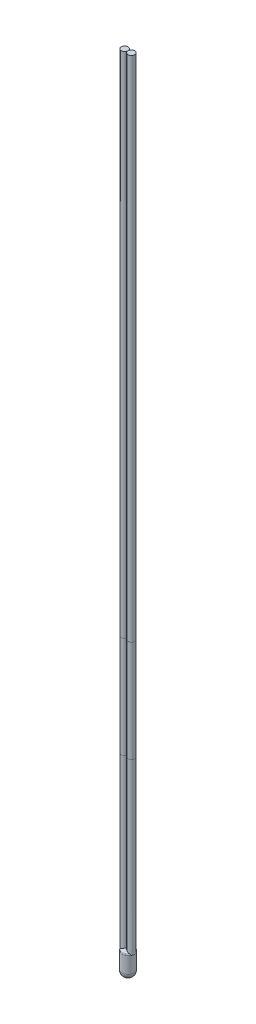
ISO-10303-21;
HEADER;
FILE_DESCRIPTION(('STEP AP214'),'2;1');
FILE_NAME('part.step','',(''),(''),'','','');
FILE_SCHEMA(('AUTOMOTIVE_DESIGN { 1 0 10303 214 1 1 1 1 }'));
ENDSEC;
DATA;
#1=APPLICATION_CONTEXT('core data for automotive mechanical design processes');
#2=APPLICATION_PROTOCOL_DEFINITION('international standard','automotive_design',2000,#1);
#3=PRODUCT_CONTEXT('',#1,'mechanical');
#4=PRODUCT('Part','Part','',(#3));
#5=PRODUCT_RELATED_PRODUCT_CATEGORY('part','',(#4));
#6=PRODUCT_DEFINITION_FORMATION('','',#4);
#7=PRODUCT_DEFINITION_CONTEXT('part definition',#1,'design');
#8=PRODUCT_DEFINITION('design','',#6,#7);
#9=PRODUCT_DEFINITION_SHAPE('','',#8);
#10=(LENGTH_UNIT() NAMED_UNIT(*) SI_UNIT(.MILLI.,.METRE.));
#11=(NAMED_UNIT(*) PLANE_ANGLE_UNIT() SI_UNIT($,.RADIAN.));
#12=(NAMED_UNIT(*) SI_UNIT($,.STERADIAN.) SOLID_ANGLE_UNIT());
#13=UNCERTAINTY_MEASURE_WITH_UNIT(LENGTH_MEASURE(1.E-05),#10,'distance_accuracy_value','');
#14=(GEOMETRIC_REPRESENTATION_CONTEXT(3) GLOBAL_UNCERTAINTY_ASSIGNED_CONTEXT((#13)) GLOBAL_UNIT_ASSIGNED_CONTEXT((#10,
#11,#12)) REPRESENTATION_CONTEXT('',''));
#15=CARTESIAN_POINT('',(0.,0.,0.));
#16=DIRECTION('',(0.,0.,1.));
#17=DIRECTION('',(1.,0.,0.));
#18=AXIS2_PLACEMENT_3D('',#15,#16,#17);
#19=CARTESIAN_POINT('',(0.4,117.41515621348,0.));
#20=DIRECTION('',(0.,-1.,0.));
#21=DIRECTION('',(0.,0.,-1.));
#22=AXIS2_PLACEMENT_3D('',#19,#20,#21);
#23=CYLINDRICAL_SURFACE('',#22,0.5);
#24=CARTESIAN_POINT('',(0.4,117.41515621348,0.));
#25=DIRECTION('',(0.,-1.,0.));
#26=DIRECTION('',(0.,0.,-1.));
#27=AXIS2_PLACEMENT_3D('',#24,#25,#26);
#28=CIRCLE('',#27,0.5);
#29=CARTESIAN_POINT('',(0.4,117.41515621348,-0.5));
#30=VERTEX_POINT('',#29);
#31=EDGE_CURVE('E11',#30,#30,#28,.T.);
#32=ORIENTED_EDGE('',*,*,#31,.T.);
#33=EDGE_LOOP('',(#32));
#34=FACE_BOUND('',#33,.T.);
#35=CARTESIAN_POINT('',(0.4,42.4151562134801,0.));
#36=DIRECTION('',(0.,-1.,0.));
#37=DIRECTION('',(0.,0.,-1.));
#38=AXIS2_PLACEMENT_3D('',#35,#36,#37);
#39=CIRCLE('',#38,0.5);
#40=CARTESIAN_POINT('',(0.4,42.4151562134801,-0.5));
#41=VERTEX_POINT('',#40);
#42=EDGE_CURVE('E46',#41,#41,#39,.T.);
#43=ORIENTED_EDGE('',*,*,#42,.F.);
#44=EDGE_LOOP('',(#43));
#45=FACE_BOUND('',#44,.T.);
#46=ADVANCED_FACE('F43',(#34,#45),#23,.T.);
#47=CARTESIAN_POINT('',(0.4,117.41515621348,0.));
#48=DIRECTION('',(0.,-1.,0.));
#49=DIRECTION('',(0.,0.,-1.));
#50=AXIS2_PLACEMENT_3D('',#47,#48,#49);
#51=PLANE('',#50);
#52=ORIENTED_EDGE('',*,*,#31,.F.);
#53=EDGE_LOOP('',(#52));
#54=FACE_BOUND('',#53,.T.);
#55=ADVANCED_FACE('F58',(#54),#51,.F.);
#56=CARTESIAN_POINT('',(0.4,42.4151562134801,0.));
#57=DIRECTION('',(0.,-1.,0.));
#58=DIRECTION('',(0.,0.,-1.));
#59=AXIS2_PLACEMENT_3D('',#56,#57,#58);
#60=PLANE('',#59);
#61=ORIENTED_EDGE('',*,*,#42,.T.);
#62=EDGE_LOOP('',(#61));
#63=FACE_BOUND('',#62,.T.);
#64=ADVANCED_FACE('F55',(#63),#60,.T.);
#65=CLOSED_SHELL('',(#46,#55,#64));
#66=MANIFOLD_SOLID_BREP('B2',#65);
#67=CARTESIAN_POINT('',(1.41,117.41515621348,0.));
#68=DIRECTION('',(0.,-1.,0.));
#69=DIRECTION('',(0.,0.,-1.));
#70=AXIS2_PLACEMENT_3D('',#67,#68,#69);
#71=CYLINDRICAL_SURFACE('',#70,0.5);
#72=CARTESIAN_POINT('',(1.41,117.41515621348,0.));
#73=DIRECTION('',(0.,-1.,0.));
#74=DIRECTION('',(0.,0.,-1.));
#75=AXIS2_PLACEMENT_3D('',#72,#73,#74);
#76=CIRCLE('',#75,0.5);
#77=CARTESIAN_POINT('',(1.41,117.41515621348,-0.5));
#78=VERTEX_POINT('',#77);
#79=EDGE_CURVE('E42',#78,#78,#76,.T.);
#80=ORIENTED_EDGE('',*,*,#79,.T.);
#81=EDGE_LOOP('',(#80));
#82=FACE_BOUND('',#81,.T.);
#83=CARTESIAN_POINT('',(1.41,42.4151562134801,0.));
#84=DIRECTION('',(0.,-1.,0.));
#85=DIRECTION('',(0.,0.,-1.));
#86=AXIS2_PLACEMENT_3D('',#83,#84,#85);
#87=CIRCLE('',#86,0.5);
#88=CARTESIAN_POINT('',(1.41,42.4151562134801,-0.5));
#89=VERTEX_POINT('',#88);
#90=EDGE_CURVE('E96',#89,#89,#87,.T.);
#91=ORIENTED_EDGE('',*,*,#90,.F.);
#92=EDGE_LOOP('',(#91));
#93=FACE_BOUND('',#92,.T.);
#94=ADVANCED_FACE('F93',(#82,#93),#71,.T.);
#95=CARTESIAN_POINT('',(1.41,117.41515621348,0.));
#96=DIRECTION('',(0.,-1.,0.));
#97=DIRECTION('',(0.,0.,-1.));
#98=AXIS2_PLACEMENT_3D('',#95,#96,#97);
#99=PLANE('',#98);
#100=ORIENTED_EDGE('',*,*,#79,.F.);
#101=EDGE_LOOP('',(#100));
#102=FACE_BOUND('',#101,.T.);
#103=ADVANCED_FACE('F108',(#102),#99,.F.);
#104=CARTESIAN_POINT('',(1.41,42.4151562134801,0.));
#105=DIRECTION('',(0.,-1.,0.));
#106=DIRECTION('',(0.,0.,-1.));
#107=AXIS2_PLACEMENT_3D('',#104,#105,#106);
#108=PLANE('',#107);
#109=ORIENTED_EDGE('',*,*,#90,.T.);
#110=EDGE_LOOP('',(#109));
#111=FACE_BOUND('',#110,.T.);
#112=ADVANCED_FACE('F105',(#111),#108,.T.);
#113=CLOSED_SHELL('',(#94,#103,#112));
#114=MANIFOLD_SOLID_BREP('B6',#113);
#115=CARTESIAN_POINT('',(0.4,42.41515621348,0.));
#116=DIRECTION('',(0.,-1.,0.));
#117=DIRECTION('',(0.,0.,-1.));
#118=AXIS2_PLACEMENT_3D('',#115,#116,#117);
#119=CYLINDRICAL_SURFACE('',#118,0.5);
#120=CARTESIAN_POINT('',(0.4,42.41515621348,0.));
#121=DIRECTION('',(0.,-1.,0.));
#122=DIRECTION('',(0.,0.,-1.));
#123=AXIS2_PLACEMENT_3D('',#120,#121,#122);
#124=CIRCLE('',#123,0.5);
#125=CARTESIAN_POINT('',(0.4,42.41515621348,-0.5));
#126=VERTEX_POINT('',#125);
#127=EDGE_CURVE('E92',#126,#126,#124,.T.);
#128=ORIENTED_EDGE('',*,*,#127,.T.);
#129=EDGE_LOOP('',(#128));
#130=FACE_BOUND('',#129,.T.);
#131=CARTESIAN_POINT('',(0.4,27.4151562134801,0.));
#132=DIRECTION('',(0.,-1.,0.));
#133=DIRECTION('',(0.,0.,-1.));
#134=AXIS2_PLACEMENT_3D('',#131,#132,#133);
#135=CIRCLE('',#134,0.5);
#136=CARTESIAN_POINT('',(0.4,27.4151562134801,-0.5));
#137=VERTEX_POINT('',#136);
#138=EDGE_CURVE('E146',#137,#137,#135,.T.);
#139=ORIENTED_EDGE('',*,*,#138,.F.);
#140=EDGE_LOOP('',(#139));
#141=FACE_BOUND('',#140,.T.);
#142=ADVANCED_FACE('F143',(#130,#141),#119,.T.);
#143=CARTESIAN_POINT('',(0.4,42.41515621348,0.));
#144=DIRECTION('',(0.,-1.,0.));
#145=DIRECTION('',(0.,0.,-1.));
#146=AXIS2_PLACEMENT_3D('',#143,#144,#145);
#147=PLANE('',#146);
#148=ORIENTED_EDGE('',*,*,#127,.F.);
#149=EDGE_LOOP('',(#148));
#150=FACE_BOUND('',#149,.T.);
#151=ADVANCED_FACE('F158',(#150),#147,.F.);
#152=CARTESIAN_POINT('',(0.4,27.4151562134801,0.));
#153=DIRECTION('',(0.,-1.,0.));
#154=DIRECTION('',(0.,0.,-1.));
#155=AXIS2_PLACEMENT_3D('',#152,#153,#154);
#156=PLANE('',#155);
#157=ORIENTED_EDGE('',*,*,#138,.T.);
#158=EDGE_LOOP('',(#157));
#159=FACE_BOUND('',#158,.T.);
#160=ADVANCED_FACE('F155',(#159),#156,.T.);
#161=CLOSED_SHELL('',(#142,#151,#160));
#162=MANIFOLD_SOLID_BREP('B37',#161);
#163=CARTESIAN_POINT('',(1.41,42.41515621348,0.));
#164=DIRECTION('',(0.,-1.,0.));
#165=DIRECTION('',(0.,0.,-1.));
#166=AXIS2_PLACEMENT_3D('',#163,#164,#165);
#167=CYLINDRICAL_SURFACE('',#166,0.5);
#168=CARTESIAN_POINT('',(1.41,42.41515621348,0.));
#169=DIRECTION('',(0.,-1.,0.));
#170=DIRECTION('',(0.,0.,-1.));
#171=AXIS2_PLACEMENT_3D('',#168,#169,#170);
#172=CIRCLE('',#171,0.5);
#173=CARTESIAN_POINT('',(1.41,42.41515621348,-0.5));
#174=VERTEX_POINT('',#173);
#175=EDGE_CURVE('E142',#174,#174,#172,.T.);
#176=ORIENTED_EDGE('',*,*,#175,.T.);
#177=EDGE_LOOP('',(#176));
#178=FACE_BOUND('',#177,.T.);
#179=CARTESIAN_POINT('',(1.41,27.4151562134801,0.));
#180=DIRECTION('',(0.,-1.,0.));
#181=DIRECTION('',(0.,0.,-1.));
#182=AXIS2_PLACEMENT_3D('',#179,#180,#181);
#183=CIRCLE('',#182,0.5);
#184=CARTESIAN_POINT('',(1.41,27.4151562134801,-0.5));
#185=VERTEX_POINT('',#184);
#186=EDGE_CURVE('E197',#185,#185,#183,.T.);
#187=ORIENTED_EDGE('',*,*,#186,.F.);
#188=EDGE_LOOP('',(#187));
#189=FACE_BOUND('',#188,.T.);
#190=ADVANCED_FACE('F194',(#178,#189),#167,.T.);
#191=CARTESIAN_POINT('',(1.41,42.41515621348,0.));
#192=DIRECTION('',(0.,-1.,0.));
#193=DIRECTION('',(0.,0.,-1.));
#194=AXIS2_PLACEMENT_3D('',#191,#192,#193);
#195=PLANE('',#194);
#196=ORIENTED_EDGE('',*,*,#175,.F.);
#197=EDGE_LOOP('',(#196));
#198=FACE_BOUND('',#197,.T.);
#199=ADVANCED_FACE('F209',(#198),#195,.F.);
#200=CARTESIAN_POINT('',(1.41,27.4151562134801,0.));
#201=DIRECTION('',(0.,-1.,0.));
#202=DIRECTION('',(0.,0.,-1.));
#203=AXIS2_PLACEMENT_3D('',#200,#201,#202);
#204=PLANE('',#203);
#205=ORIENTED_EDGE('',*,*,#186,.T.);
#206=EDGE_LOOP('',(#205));
#207=FACE_BOUND('',#206,.T.);
#208=ADVANCED_FACE('F206',(#207),#204,.T.);
#209=CLOSED_SHELL('',(#190,#199,#208));
#210=MANIFOLD_SOLID_BREP('B87',#209);
#211=CARTESIAN_POINT('',(0.9,2.41515621348005,0.));
#212=DIRECTION('',(0.,-1.,0.));
#213=DIRECTION('',(0.,0.,-1.));
#214=AXIS2_PLACEMENT_3D('',#211,#212,#213);
#215=TOROIDAL_SURFACE('',#214,0.7,0.2);
#216=CARTESIAN_POINT('',(0.342710554276178,2.6096711374537,-0.496707076060587));
#217=CARTESIAN_POINT('',(0.326116842533661,2.60699686254503,-0.494806533452094));
#218=CARTESIAN_POINT('',(0.309770034542115,2.6034465481936,-0.492066096214566));
#219=CARTESIAN_POINT('',(0.277889544530881,2.59470746117517,-0.48512967125796));
#220=CARTESIAN_POINT('',(0.262353719484357,2.58952329123451,-0.480937769219657));
#221=CARTESIAN_POINT('',(0.240017999274765,2.58066687672155,-0.473777730533588));
#222=CARTESIAN_POINT('',(0.232822842991616,2.57758212381183,-0.471284008196725));
#223=CARTESIAN_POINT('',(0.219024349225774,2.57118780814072,-0.466153855243099));
#224=CARTESIAN_POINT('',(0.212408981894553,2.56789487751942,-0.463529092972427));
#225=CARTESIAN_POINT('',(0.191949179806998,2.55694717914873,-0.454911632549412));
#226=CARTESIAN_POINT('',(0.178598488792885,2.54865469906437,-0.448536577987828));
#227=CARTESIAN_POINT('',(0.153524784459558,2.53020932378214,-0.435257162414345));
#228=CARTESIAN_POINT('',(0.141799299389649,2.52005930947381,-0.428353630542701));
#229=CARTESIAN_POINT('',(0.126569418460339,2.50363697795189,-0.418649525357035));
#230=CARTESIAN_POINT('',(0.122113207881949,2.49833768250554,-0.415697637179596));
#231=CARTESIAN_POINT('',(0.113792469919316,2.48716320505702,-0.410012721510245));
#232=CARTESIAN_POINT('',(0.109928621893607,2.48128737432261,-0.407279946999101));
#233=CARTESIAN_POINT('',(0.102936878314275,2.46879544056318,-0.402209449874787));
#234=CARTESIAN_POINT('',(0.0998222709618778,2.46216866395595,-0.399879041914674));
#235=CARTESIAN_POINT('',(0.094741260965691,2.44827830657245,-0.396014595776549));
#236=CARTESIAN_POINT('',(0.0927685097705873,2.44101851011371,-0.394476159746476));
#237=CARTESIAN_POINT('',(0.0910191836531889,2.43051207891519,-0.393104583886525));
#238=CARTESIAN_POINT('',(0.0906334576828592,2.42742055037154,-0.392800747026939));
#239=CARTESIAN_POINT('',(0.0901213443102036,2.42120391854913,-0.392396925349576));
#240=CARTESIAN_POINT('',(0.0899946835782171,2.41807885415697,-0.392296725682827));
#241=CARTESIAN_POINT('',(0.0900011063698889,2.41442991486687,-0.392301775511847));
#242=CARTESIAN_POINT('',(0.0900057868956716,2.4139036851019,-0.392305472963729));
#243=CARTESIAN_POINT('',(0.090014235433944,2.413377623837,-0.392312153477811));
#244=B_SPLINE_CURVE_WITH_KNOTS('',3,(#216,#217,#218,#219,#220,#221,#222,#223,#224,#225,#226,
#227,#228,#229,#230,#231,#232,#233,#234,#235,#236,#237,#238,#239,#240,#241,#242,#243),
.UNSPECIFIED.,.F.,.F.,(4,2,2,2,2,2,2,2,2,2,2,2,2,4),(0.,0.0506923185590828,0.101243089641447,
0.125877301665452,0.149389824798402,0.20011250552543,0.25075717596154,0.27330306641228,
0.295874623529552,0.3188210426462,0.341638626278481,0.351015232615933,0.360381940946825,
0.361960632231357),.UNSPECIFIED.);
#245=CARTESIAN_POINT('',(0.20555555555555,2.56422741198005,-0.460642331993803));
#246=VERTEX_POINT('',#245);
#247=CARTESIAN_POINT('',(0.0899999999999998,2.41515621348005,-0.39230090491866));
#248=VERTEX_POINT('',#247);
#249=EDGE_CURVE('E192',#246,#248,#244,.T.);
#250=ORIENTED_EDGE('',*,*,#249,.F.);
#251=CARTESIAN_POINT('',(0.9,2.56422741198004,0.));
#252=DIRECTION('',(0.,-1.,0.));
#253=DIRECTION('',(0.,0.,-1.));
#254=AXIS2_PLACEMENT_3D('',#251,#252,#253);
#255=CIRCLE('',#254,0.833333333333334);
#256=CARTESIAN_POINT('',(1.59072984749455,2.56422741198004,-0.466193867639426));
#257=VERTEX_POINT('',#256);
#258=EDGE_CURVE('E308',#257,#246,#255,.F.);
#259=ORIENTED_EDGE('',*,*,#258,.F.);
#260=CARTESIAN_POINT('',(1.70365777107542,2.40610173241104,-0.404679025262014));
#261=CARTESIAN_POINT('',(1.70389604383328,2.40904204718788,-0.404505427623607));
#262=CARTESIAN_POINT('',(1.70401566567529,2.41199833082941,-0.404418765222738));
#263=CARTESIAN_POINT('',(1.70402668102433,2.42065067536452,-0.404411663469807));
#264=CARTESIAN_POINT('',(1.70360453014876,2.42635106369644,-0.404719190328309));
#265=CARTESIAN_POINT('',(1.70193926885174,2.43757238417548,-0.40592158000119));
#266=CARTESIAN_POINT('',(1.70069414529646,2.44309284134493,-0.406817883031015));
#267=CARTESIAN_POINT('',(1.69705529388377,2.45534086403292,-0.409396462160241));
#268=CARTESIAN_POINT('',(1.69443632157332,2.46196830108167,-0.411229328202113));
#269=CARTESIAN_POINT('',(1.6883251125363,2.47463803783951,-0.415390033418));
#270=CARTESIAN_POINT('',(1.68483062700322,2.48067877425613,-0.41771914488632));
#271=CARTESIAN_POINT('',(1.67457897002656,2.49613661768594,-0.424329704327437));
#272=CARTESIAN_POINT('',(1.667222470359,2.50504524868047,-0.428858950109334));
#273=CARTESIAN_POINT('',(1.65127117178204,2.52156502452982,-0.438034406679147));
#274=CARTESIAN_POINT('',(1.64267468715311,2.52917437179056,-0.44268076947054));
#275=CARTESIAN_POINT('',(1.6201387405292,2.54676032002925,-0.453945963240291));
#276=CARTESIAN_POINT('',(1.60562904284585,2.55609680442867,-0.46042934676598));
#277=CARTESIAN_POINT('',(1.57632755446303,2.57208750828596,-0.471766359791853));
#278=CARTESIAN_POINT('',(1.56165246645707,2.57889713278662,-0.476709163323295));
#279=CARTESIAN_POINT('',(1.53128617958988,2.59087557342621,-0.485322279187297));
#280=CARTESIAN_POINT('',(1.51559544942571,2.59604514000795,-0.488993173579545));
#281=CARTESIAN_POINT('',(1.49493789755737,2.6015840638918,-0.492755412583465));
#282=CARTESIAN_POINT('',(1.49029630685466,2.60274909314161,-0.493533560329727));
#283=CARTESIAN_POINT('',(1.48562913972113,2.60384128817484,-0.494247137801567));
#284=B_SPLINE_CURVE_WITH_KNOTS('',3,(#260,#261,#262,#263,#264,#265,#266,#267,#268,#269,#270,
#271,#272,#273,#274,#275,#276,#277,#278,#279,#280,#281,#282,#283),.UNSPECIFIED.,.F.,.F.,(4,2,2,
2,2,2,2,2,2,2,2,4),(0.,0.00886575648618146,0.0259339496332779,0.0430440498313493,
0.0649928462677814,0.0869986080411961,0.124018945287599,0.161090093301615,0.216128364020064,
0.266736732211443,0.317321909974178,0.331862894329271),.UNSPECIFIED.);
#285=CARTESIAN_POINT('',(1.70401960784314,2.41515621348005,-0.404416209125905));
#286=VERTEX_POINT('',#285);
#287=EDGE_CURVE('E305',#286,#257,#284,.T.);
#288=ORIENTED_EDGE('',*,*,#287,.F.);
#289=CARTESIAN_POINT('',(0.9,2.41515621348005,0.));
#290=DIRECTION('',(0.,-1.,0.));
#291=DIRECTION('',(0.,0.,-1.));
#292=AXIS2_PLACEMENT_3D('',#289,#290,#291);
#293=CIRCLE('',#292,0.9);
#294=EDGE_CURVE('E285',#248,#286,#293,.T.);
#295=ORIENTED_EDGE('',*,*,#294,.F.);
#296=EDGE_LOOP('',(#250,#259,#288,#295));
#297=FACE_BOUND('',#296,.T.);
#298=ADVANCED_FACE('F236',(#297),#215,.T.);
#299=CARTESIAN_POINT('',(0.9,0.,0.));
#300=DIRECTION('',(0.,1.,0.));
#301=DIRECTION('',(-1.,0.,0.));
#302=AXIS2_PLACEMENT_3D('',#299,#300,#301);
#303=SPHERICAL_SURFACE('',#302,0.9);
#304=CARTESIAN_POINT('',(0.9,0.,0.));
#305=DIRECTION('',(0.,1.,0.));
#306=DIRECTION('',(-1.,0.,0.));
#307=AXIS2_PLACEMENT_3D('',#304,#305,#306);
#308=CIRCLE('',#307,0.9);
#309=CARTESIAN_POINT('',(0.,0.,0.));
#310=VERTEX_POINT('',#309);
#311=EDGE_CURVE('E337',#310,#310,#308,.T.);
#312=ORIENTED_EDGE('',*,*,#311,.F.);
#313=EDGE_LOOP('',(#312));
#314=FACE_BOUND('',#313,.T.);
#315=ADVANCED_FACE('F343',(#314),#303,.T.);
#316=CARTESIAN_POINT('',(0.9,1.63253242135513,0.));
#317=DIRECTION('',(0.,1.,0.));
#318=DIRECTION('',(1.,0.,0.));
#319=AXIS2_PLACEMENT_3D('',#316,#317,#318);
#320=SPHERICAL_SURFACE('',#319,1.25);
#321=CARTESIAN_POINT('',(0.205182917559304,2.56402741198004,0.460484857937039));
#322=CARTESIAN_POINT('',(0.233971584158858,2.57949526742104,0.472674656549754));
#323=CARTESIAN_POINT('',(0.263834888614331,2.59512545143631,0.482115388207938));
#324=CARTESIAN_POINT('',(0.324882062922831,2.62632224782333,0.495309528813332));
#325=CARTESIAN_POINT('',(0.356067821667557,2.64188873188452,0.499054500458566));
#326=CARTESIAN_POINT('',(0.418868509860483,2.6725351977644,0.500631357110796));
#327=CARTESIAN_POINT('',(0.450483793776784,2.68761473810425,0.498458020702542));
#328=CARTESIAN_POINT('',(0.513114021740049,2.71688826275654,0.488069098474938));
#329=CARTESIAN_POINT('',(0.544129378775547,2.73108287238938,0.479857832973678));
#330=CARTESIAN_POINT('',(0.603432306628539,2.75774534996512,0.457799964373355));
#331=CARTESIAN_POINT('',(0.63177740277301,2.77025632705399,0.444161179464198));
#332=CARTESIAN_POINT('',(0.685848125636114,2.79377590530834,0.411446097920221));
#333=CARTESIAN_POINT('',(0.711574532985435,2.80478495453323,0.392371428202314));
#334=CARTESIAN_POINT('',(0.757386234603006,2.82415850848364,0.350930619761693));
#335=CARTESIAN_POINT('',(0.777757354729829,2.83266364843309,0.328946524829438));
#336=CARTESIAN_POINT('',(0.814462558606548,2.84785970765273,0.281289176263675));
#337=CARTESIAN_POINT('',(0.830799225234937,2.85455178792111,0.255618299665267));
#338=CARTESIAN_POINT('',(0.857489245941004,2.8654218425138,0.203674733719494));
#339=CARTESIAN_POINT('',(0.868231347853134,2.8697643923131,0.177635896499791));
#340=CARTESIAN_POINT('',(0.885222369941649,2.87661208723217,0.123903501967717));
#341=CARTESIAN_POINT('',(0.891473128337311,2.8791179840666,0.0962106266531178));
#342=CARTESIAN_POINT('',(0.898965910680979,2.88211954734321,0.041750685962971));
#343=CARTESIAN_POINT('',(0.900485702044778,2.88272670445036,0.0150276235124846));
#344=CARTESIAN_POINT('',(0.899243453810239,2.88222979873035,-0.0383002481093894));
#345=CARTESIAN_POINT('',(0.896482151276341,2.88112603046862,-0.0649050768459279));
#346=CARTESIAN_POINT('',(0.886891665044591,2.87727947030919,-0.116688452941977));
#347=CARTESIAN_POINT('',(0.880145165673852,2.87456998989427,-0.141884903175672));
#348=CARTESIAN_POINT('',(0.862915071091583,2.86761424336565,-0.190737089252798));
#349=CARTESIAN_POINT('',(0.852431290747823,2.86336790112086,-0.214392748702007));
#350=CARTESIAN_POINT('',(0.827847365191678,2.85334074109884,-0.260064618192789));
#351=CARTESIAN_POINT('',(0.813674408302836,2.84752893513014,-0.28203472413694));
#352=CARTESIAN_POINT('',(0.782325180159593,2.83455869971222,-0.323262438719852));
#353=CARTESIAN_POINT('',(0.76514827462216,2.82739998583946,-0.342519472940525));
#354=CARTESIAN_POINT('',(0.727311137323574,2.81146328909359,-0.37893874801752));
#355=CARTESIAN_POINT('',(0.706510338279955,2.80261740798576,-0.395925003168429));
#356=CARTESIAN_POINT('',(0.662825996518049,2.78379890967995,-0.426179697109884));
#357=CARTESIAN_POINT('',(0.639941911935652,2.77382599917705,-0.439447164959857));
#358=CARTESIAN_POINT('',(0.590919832600233,2.7521510713304,-0.462972988952616));
#359=CARTESIAN_POINT('',(0.564666839933957,2.7403751389565,-0.47292344590208));
#360=CARTESIAN_POINT('',(0.511227452652452,2.7159880826072,-0.488264537929489));
#361=CARTESIAN_POINT('',(0.484040514212588,2.70337646791455,-0.493652467818506));
#362=CARTESIAN_POINT('',(0.427237457098062,2.67653045612116,-0.500139281132722));
#363=CARTESIAN_POINT('',(0.397601214368659,2.66224699485777,-0.500859985120792));
#364=CARTESIAN_POINT('',(0.338870422099756,2.63332105552434,-0.497120048615694));
#365=CARTESIAN_POINT('',(0.309775477916851,2.61867885861429,-0.492663346304868));
#366=CARTESIAN_POINT('',(0.255320650322216,2.59065781757185,-0.479358510250095));
#367=CARTESIAN_POINT('',(0.229856889277791,2.57728070845502,-0.470929440354684));
#368=CARTESIAN_POINT('',(0.205182917559304,2.56402741198004,-0.460484857937039));
#369=B_SPLINE_CURVE_WITH_KNOTS('',3,(#321,#322,#323,#324,#325,#326,#327,#328,#329,#330,#331,
#332,#333,#334,#335,#336,#337,#338,#339,#340,#341,#342,#343,#344,#345,#346,#347,#348,#349,#350,
#351,#352,#353,#354,#355,#356,#357,#358,#359,#360,#361,#362,#363,#364,#365,#366,#367,#368),
.UNSPECIFIED.,.F.,.F.,(4,2,2,2,2,2,2,2,2,2,2,2,2,2,2,2,2,2,2,2,2,2,2,4),(0.,0.104519174425416,
0.20919302598907,0.313959255757587,0.418650595024414,0.519668928761857,0.6206570602141,
0.713619584423865,0.806522438342577,0.891580597992968,0.976603925137676,1.05653092171055,
1.13644415899511,1.21475488229791,1.29306948538767,1.37306552614627,1.45307847848861,
1.53753986329398,1.62202327967901,1.71297064324907,1.80397189315789,1.90226336413096,
2.0004801188466,2.09008976680499),.UNSPECIFIED.);
#370=CARTESIAN_POINT('',(0.205555555555564,2.56422741198004,0.460642331993819));
#371=VERTEX_POINT('',#370);
#372=EDGE_CURVE('E347',#371,#246,#369,.T.);
#373=ORIENTED_EDGE('',*,*,#372,.F.);
#374=CARTESIAN_POINT('',(1.59072984749456,2.56422741198005,0.466193867639412));
#375=VERTEX_POINT('',#374);
#376=EDGE_CURVE('E300',#371,#375,#255,.F.);
#377=ORIENTED_EDGE('',*,*,#376,.T.);
#378=CARTESIAN_POINT('',(1.59109517886343,2.56402741198004,-0.466052074550069));
#379=CARTESIAN_POINT('',(1.56189929971724,2.58002767649732,-0.477407235839446));
#380=CARTESIAN_POINT('',(1.5316818590507,2.5961449455477,-0.485980166226311));
#381=CARTESIAN_POINT('',(1.47003320094678,2.62823131959863,-0.497371058581141));
#382=CARTESIAN_POINT('',(1.43859984411662,2.64420009583865,-0.500178358563004));
#383=CARTESIAN_POINT('',(1.37542839785553,2.67556238685268,-0.499803811214582));
#384=CARTESIAN_POINT('',(1.34369001114371,2.69095524923342,-0.496615369641568));
#385=CARTESIAN_POINT('',(1.28097777461012,2.72075295437588,-0.48412176576904));
#386=CARTESIAN_POINT('',(1.2500032981187,2.7351586254868,-0.474821802782654));
#387=CARTESIAN_POINT('',(1.19119294317666,2.76202627839447,-0.450656230430503));
#388=CARTESIAN_POINT('',(1.16327971356393,2.77454471742959,-0.43604282063928));
#389=CARTESIAN_POINT('',(1.11024446611085,2.79798858132722,-0.401432061815022));
#390=CARTESIAN_POINT('',(1.0851215269075,2.80891453240887,-0.381436497498158));
#391=CARTESIAN_POINT('',(1.0407752687385,2.82797897301611,-0.338444173481457));
#392=CARTESIAN_POINT('',(1.02123170291811,2.83627562384071,-0.31584813612629));
#393=CARTESIAN_POINT('',(0.986276705625963,2.85099541362998,-0.267124775723333));
#394=CARTESIAN_POINT('',(0.970862515398599,2.85741980366905,-0.240999827911772));
#395=CARTESIAN_POINT('',(0.946031278855372,2.86771350626024,-0.188425340736445));
#396=CARTESIAN_POINT('',(0.936210315890858,2.87175597935573,-0.162200075210661));
#397=CARTESIAN_POINT('',(0.921062025827062,2.87797472146548,-0.108272579146993));
#398=CARTESIAN_POINT('',(0.915732890355399,2.88015174150149,-0.0805709477619912));
#399=CARTESIAN_POINT('',(0.909985745536684,2.8824987342198,-0.026233701363912));
#400=CARTESIAN_POINT('',(0.909297636932613,2.8827790922807,0.000368946361625292));
#401=CARTESIAN_POINT('',(0.912143936315899,2.88161749969605,0.0533066389657466));
#402=CARTESIAN_POINT('',(0.915677693397838,2.88017581454623,0.0796417244644516));
#403=CARTESIAN_POINT('',(0.926726744789865,2.87565094977677,0.130850792933531));
#404=CARTESIAN_POINT('',(0.934175093104653,2.87259536624814,0.155741755923523));
#405=CARTESIAN_POINT('',(0.952722090923995,2.86494389413218,0.203867942016433));
#406=CARTESIAN_POINT('',(0.963820990405837,2.86034790006239,0.227103051599558));
#407=CARTESIAN_POINT('',(0.989597939229971,2.84959432158708,0.271933709776604));
#408=CARTESIAN_POINT('',(1.00436148335052,2.84339926927445,0.293470980003378));
#409=CARTESIAN_POINT('',(1.0367915879172,2.82966219620989,0.333743067860019));
#410=CARTESIAN_POINT('',(1.05445882941956,2.82211985941902,0.352477226051678));
#411=CARTESIAN_POINT('',(1.09327705208838,2.80536302982811,0.387835742875559));
#412=CARTESIAN_POINT('',(1.11457375722783,2.79607519027448,0.404265102837223));
#413=CARTESIAN_POINT('',(1.15913640261654,2.77637589549268,0.433331107082242));
#414=CARTESIAN_POINT('',(1.18240282445218,2.76596416530646,0.445966820383854));
#415=CARTESIAN_POINT('',(1.23219161707357,2.74334399642579,0.46817252389763));
#416=CARTESIAN_POINT('',(1.25882534023157,2.73105839843051,0.477414056831497));
#417=CARTESIAN_POINT('',(1.3129000686153,2.70566023022712,0.491275639916515));
#418=CARTESIAN_POINT('',(1.34034165891586,2.69254705239527,0.495892251401175));
#419=CARTESIAN_POINT('',(1.39761543819291,2.66463842718479,0.500739180828493));
#420=CARTESIAN_POINT('',(1.42745706499141,2.64979367367308,0.500573783170588));
#421=CARTESIAN_POINT('',(1.48643521179335,2.61978102430603,0.495008580568989));
#422=CARTESIAN_POINT('',(1.51557260551271,2.60461357795685,0.489615643314676));
#423=CARTESIAN_POINT('',(1.55994387438109,2.58096875538201,0.477275167916566));
#424=CARTESIAN_POINT('',(1.57566459684504,2.57247832366036,0.47205019083586));
#425=CARTESIAN_POINT('',(1.59109517886369,2.56402741198005,0.466052074550976));
#426=B_SPLINE_CURVE_WITH_KNOTS('',3,(#378,#379,#380,#381,#382,#383,#384,#385,#386,#387,#388,
#389,#390,#391,#392,#393,#394,#395,#396,#397,#398,#399,#400,#401,#402,#403,#404,#405,#406,#407,
#408,#409,#410,#411,#412,#413,#414,#415,#416,#417,#418,#419,#420,#421,#422,#423,#424,#425),
.UNSPECIFIED.,.F.,.F.,(4,2,2,2,2,2,2,2,2,2,2,2,2,2,2,2,2,2,2,2,2,2,2,4),(0.,0.105413590810882,
0.211021940887962,0.316746509188022,0.422381249651535,0.523545438942917,0.624676123545768,
0.717192495524503,0.809646904095704,0.894090213258967,0.97849950998854,1.057950460998,
1.13738916425129,1.21551153567365,1.29363925776357,1.37379673241425,1.45397303473647,
1.53897770241468,1.62400321368638,1.71586967701633,1.80780439322422,1.90736700377021,
2.00679899078983,2.06256833756391),.UNSPECIFIED.);
#427=EDGE_CURVE('E331',#257,#375,#426,.T.);
#428=ORIENTED_EDGE('',*,*,#427,.F.);
#429=ORIENTED_EDGE('',*,*,#258,.T.);
#430=EDGE_LOOP('',(#373,#377,#428,#429));
#431=FACE_BOUND('',#430,.T.);
#432=ADVANCED_FACE('F340',(#431),#320,.T.);
#433=CARTESIAN_POINT('',(0.9,2.88253242135513,0.));
#434=DIRECTION('',(0.,1.,0.));
#435=DIRECTION('',(-1.,0.,0.));
#436=AXIS2_PLACEMENT_3D('',#433,#434,#435);
#437=CYLINDRICAL_SURFACE('',#436,0.9);
#438=CARTESIAN_POINT('',(1.70401960784314,2.41515621348005,0.404416209125905));
#439=VERTEX_POINT('',#438);
#440=EDGE_CURVE('E304',#286,#439,#293,.T.);
#441=ORIENTED_EDGE('',*,*,#440,.T.);
#442=CARTESIAN_POINT('',(0.0899999999999999,2.41515621348005,0.392300904918661));
#443=VERTEX_POINT('',#442);
#444=EDGE_CURVE('E284',#439,#443,#293,.T.);
#445=ORIENTED_EDGE('',*,*,#444,.T.);
#446=EDGE_CURVE('E280',#443,#248,#293,.T.);
#447=ORIENTED_EDGE('',*,*,#446,.T.);
#448=ORIENTED_EDGE('',*,*,#294,.T.);
#449=EDGE_LOOP('',(#441,#445,#447,#448));
#450=FACE_BOUND('',#449,.T.);
#451=ORIENTED_EDGE('',*,*,#311,.T.);
#452=EDGE_LOOP('',(#451));
#453=FACE_BOUND('',#452,.T.);
#454=ADVANCED_FACE('F302',(#450,#453),#437,.T.);
#455=CARTESIAN_POINT('',(0.0900142354339442,2.413377623837,0.392312153477811));
#456=CARTESIAN_POINT('',(0.0900057541266962,2.41390364139671,0.392305440442877));
#457=CARTESIAN_POINT('',(0.0900010761450986,2.41442987026323,0.392301745679841));
#458=CARTESIAN_POINT('',(0.0899908939182519,2.42041031500487,0.392293808879575));
#459=CARTESIAN_POINT('',(0.0903876873945785,2.42587669504093,0.392608295677278));
#460=CARTESIAN_POINT('',(0.0919483170694864,2.43663689482024,0.393833813627084));
#461=CARTESIAN_POINT('',(0.0931148108885355,2.44193004974982,0.394746911592397));
#462=CARTESIAN_POINT('',(0.0965276680783706,2.45369226976503,0.397379300853799));
#463=CARTESIAN_POINT('',(0.0989878088160566,2.4600631115645,0.399254715860878));
#464=CARTESIAN_POINT('',(0.104721951369748,2.47223817724391,0.40351421133557));
#465=CARTESIAN_POINT('',(0.107997751237576,2.47804110931123,0.405899413919345));
#466=CARTESIAN_POINT('',(0.117726504458136,2.49309236848218,0.41276817561379));
#467=CARTESIAN_POINT('',(0.124772504708991,2.50182487308936,0.417529250579425));
#468=CARTESIAN_POINT('',(0.140059269926464,2.51803623911069,0.427216257759249));
#469=CARTESIAN_POINT('',(0.148302063542647,2.52551292445657,0.432142458744883));
#470=CARTESIAN_POINT('',(0.164542651928677,2.53851689638451,0.441173893519793));
#471=CARTESIAN_POINT('',(0.172427450644795,2.54417120238612,0.445301233098171));
#472=CARTESIAN_POINT('',(0.188767779307274,2.55479637884453,0.453281191485976));
#473=CARTESIAN_POINT('',(0.197223224947138,2.55976734992808,0.457133850704057));
#474=CARTESIAN_POINT('',(0.223478603776209,2.57382184269263,0.468189803567446));
#475=CARTESIAN_POINT('',(0.242044779602056,2.5819527279381,0.47482065562956));
#476=CARTESIAN_POINT('',(0.280663118502849,2.59574200515939,0.485965007769324));
#477=CARTESIAN_POINT('',(0.300713961297395,2.6014025637741,0.490480363533088));
#478=CARTESIAN_POINT('',(0.328336954348181,2.60718920951665,0.494891121079039));
#479=CARTESIAN_POINT('',(0.335501946546303,2.60851479514757,0.49587741575288));
#480=CARTESIAN_POINT('',(0.342710554276178,2.6096711374537,0.496707076060589));
#481=B_SPLINE_CURVE_WITH_KNOTS('',3,(#455,#456,#457,#458,#459,#460,#461,#462,#463,#464,#465,
#466,#467,#468,#469,#470,#471,#472,#473,#474,#475,#476,#477,#478,#479,#480),.UNSPECIFIED.,.F.,
.F.,(4,2,2,2,2,2,2,2,2,2,2,2,4),(0.,0.0015786912829187,0.0179374896072321,0.0343530692281405,
0.0554774301409264,0.0766487767120373,0.113012766125561,0.149439130714118,0.181025015527393,
0.212606244062943,0.276272276829786,0.339882357524839,0.361927766043739),.UNSPECIFIED.);
#482=EDGE_CURVE('E249',#443,#371,#481,.T.);
#483=ORIENTED_EDGE('',*,*,#482,.F.);
#484=ORIENTED_EDGE('',*,*,#444,.F.);
#485=CARTESIAN_POINT('',(1.59036397368029,2.56442741198001,0.466335541212821));
#486=CARTESIAN_POINT('',(1.5973360796673,2.56061873238883,0.463638603004759));
#487=CARTESIAN_POINT('',(1.60414324858272,2.5566067512118,0.460825637191355));
#488=CARTESIAN_POINT('',(1.61741257768417,2.54811962537918,0.455008912208966));
#489=CARTESIAN_POINT('',(1.62387350782681,2.54364297652896,0.452004546388216));
#490=CARTESIAN_POINT('',(1.6428145479229,2.52934307579804,0.442712237661609));
#491=CARTESIAN_POINT('',(1.65466155882263,2.51875065531443,0.436220958893895));
#492=CARTESIAN_POINT('',(1.66984634078226,2.50164628895631,0.427211907447637));
#493=CARTESIAN_POINT('',(1.67423847461032,2.4961638393826,0.424501579458626));
#494=CARTESIAN_POINT('',(1.68236683833714,2.4846313911739,0.419331780696356));
#495=CARTESIAN_POINT('',(1.68610460118604,2.47858277134815,0.416871729442884));
#496=CARTESIAN_POINT('',(1.69224707788071,2.46678204273043,0.412732811012051));
#497=CARTESIAN_POINT('',(1.69476616265774,2.46111220199629,0.41099248828768));
#498=CARTESIAN_POINT('',(1.69898751193248,2.4493557903195,0.408035423593887));
#499=CARTESIAN_POINT('',(1.70069279434929,2.44327085624681,0.406816748896858));
#500=CARTESIAN_POINT('',(1.70260094593574,2.43343733893364,0.405444763930635));
#501=CARTESIAN_POINT('',(1.70313408524625,2.42978365701233,0.405058934285818));
#502=CARTESIAN_POINT('',(1.70384867679137,2.42240680459159,0.404540494899205));
#503=CARTESIAN_POINT('',(1.70402841419422,2.41868338334019,0.404409119907637));
#504=CARTESIAN_POINT('',(1.70401943137251,2.41495621348005,0.404416337423927));
#505=B_SPLINE_CURVE_WITH_KNOTS('',3,(#485,#486,#487,#488,#489,#490,#491,#492,#493,#494,#495,
#496,#497,#498,#499,#500,#501,#502,#503,#504),.UNSPECIFIED.,.F.,.F.,(4,2,2,2,2,2,2,2,2,4),(0.,
0.0251482983136293,0.0503807063279775,0.101527724062385,0.124079925354553,0.146578566848934,
0.165844550411176,0.185038521513384,0.196151794836939,0.207318861922355),.UNSPECIFIED.);
#506=EDGE_CURVE('E301',#375,#439,#505,.T.);
#507=ORIENTED_EDGE('',*,*,#506,.F.);
#508=ORIENTED_EDGE('',*,*,#376,.F.);
#509=EDGE_LOOP('',(#483,#484,#507,#508));
#510=FACE_BOUND('',#509,.T.);
#511=ADVANCED_FACE('F238',(#510),#215,.T.);
#512=CARTESIAN_POINT('',(1.41,27.4151562134801,0.));
#513=DIRECTION('',(0.,-1.,0.));
#514=DIRECTION('',(0.,0.,-1.));
#515=AXIS2_PLACEMENT_3D('',#512,#513,#514);
#516=CYLINDRICAL_SURFACE('',#515,0.5);
#517=CARTESIAN_POINT('',(1.41,27.4151562134801,0.));
#518=DIRECTION('',(0.,-1.,0.));
#519=DIRECTION('',(0.,0.,-1.));
#520=AXIS2_PLACEMENT_3D('',#517,#518,#519);
#521=CIRCLE('',#520,0.5);
#522=CARTESIAN_POINT('',(1.41,27.4151562134801,-0.5));
#523=VERTEX_POINT('',#522);
#524=EDGE_CURVE('E338',#523,#523,#521,.T.);
#525=ORIENTED_EDGE('',*,*,#524,.T.);
#526=EDGE_LOOP('',(#525));
#527=FACE_BOUND('',#526,.T.);
#528=ORIENTED_EDGE('',*,*,#427,.T.);
#529=ORIENTED_EDGE('',*,*,#506,.T.);
#530=CARTESIAN_POINT('',(1.41,2.41515621348005,0.));
#531=DIRECTION('',(0.,-1.,0.));
#532=DIRECTION('',(0.,0.,-1.));
#533=AXIS2_PLACEMENT_3D('',#530,#531,#532);
#534=CIRCLE('',#533,0.5);
#535=EDGE_CURVE('E261',#286,#439,#534,.T.);
#536=ORIENTED_EDGE('',*,*,#535,.F.);
#537=ORIENTED_EDGE('',*,*,#287,.T.);
#538=EDGE_LOOP('',(#528,#529,#536,#537));
#539=FACE_BOUND('',#538,.T.);
#540=ADVANCED_FACE('F318',(#527,#539),#516,.T.);
#541=CARTESIAN_POINT('',(1.41,27.4151562134801,0.));
#542=DIRECTION('',(0.,-1.,0.));
#543=DIRECTION('',(0.,0.,-1.));
#544=AXIS2_PLACEMENT_3D('',#541,#542,#543);
#545=PLANE('',#544);
#546=ORIENTED_EDGE('',*,*,#524,.F.);
#547=EDGE_LOOP('',(#546));
#548=FACE_BOUND('',#547,.T.);
#549=ADVANCED_FACE('F323',(#548),#545,.F.);
#550=CARTESIAN_POINT('',(1.41,2.41515621348005,0.));
#551=DIRECTION('',(0.,-1.,0.));
#552=DIRECTION('',(0.,0.,-1.));
#553=AXIS2_PLACEMENT_3D('',#550,#551,#552);
#554=PLANE('',#553);
#555=ORIENTED_EDGE('',*,*,#535,.T.);
#556=ORIENTED_EDGE('',*,*,#440,.F.);
#557=EDGE_LOOP('',(#555,#556));
#558=FACE_BOUND('',#557,.T.);
#559=ADVANCED_FACE('F325',(#558),#554,.T.);
#560=CARTESIAN_POINT('',(0.4,27.4151562134801,0.));
#561=DIRECTION('',(0.,-1.,0.));
#562=DIRECTION('',(0.,0.,-1.));
#563=AXIS2_PLACEMENT_3D('',#560,#561,#562);
#564=CYLINDRICAL_SURFACE('',#563,0.5);
#565=CARTESIAN_POINT('',(0.4,27.4151562134801,0.));
#566=DIRECTION('',(0.,-1.,0.));
#567=DIRECTION('',(0.,0.,-1.));
#568=AXIS2_PLACEMENT_3D('',#565,#566,#567);
#569=CIRCLE('',#568,0.5);
#570=CARTESIAN_POINT('',(0.4,27.4151562134801,-0.5));
#571=VERTEX_POINT('',#570);
#572=EDGE_CURVE('E293',#571,#571,#569,.T.);
#573=ORIENTED_EDGE('',*,*,#572,.T.);
#574=EDGE_LOOP('',(#573));
#575=FACE_BOUND('',#574,.T.);
#576=ORIENTED_EDGE('',*,*,#372,.T.);
#577=ORIENTED_EDGE('',*,*,#249,.T.);
#578=CARTESIAN_POINT('',(0.4,2.41515621348005,0.));
#579=DIRECTION('',(0.,-1.,0.));
#580=DIRECTION('',(0.,0.,-1.));
#581=AXIS2_PLACEMENT_3D('',#578,#579,#580);
#582=CIRCLE('',#581,0.5);
#583=EDGE_CURVE('E255',#443,#248,#582,.T.);
#584=ORIENTED_EDGE('',*,*,#583,.F.);
#585=ORIENTED_EDGE('',*,*,#482,.T.);
#586=EDGE_LOOP('',(#576,#577,#584,#585));
#587=FACE_BOUND('',#586,.T.);
#588=ADVANCED_FACE('F289',(#575,#587),#564,.T.);
#589=CARTESIAN_POINT('',(0.4,27.4151562134801,0.));
#590=DIRECTION('',(0.,-1.,0.));
#591=DIRECTION('',(0.,0.,-1.));
#592=AXIS2_PLACEMENT_3D('',#589,#590,#591);
#593=PLANE('',#592);
#594=ORIENTED_EDGE('',*,*,#572,.F.);
#595=EDGE_LOOP('',(#594));
#596=FACE_BOUND('',#595,.T.);
#597=ADVANCED_FACE('F355',(#596),#593,.F.);
#598=CARTESIAN_POINT('',(0.4,2.41515621348005,0.));
#599=DIRECTION('',(0.,-1.,0.));
#600=DIRECTION('',(0.,0.,-1.));
#601=AXIS2_PLACEMENT_3D('',#598,#599,#600);
#602=PLANE('',#601);
#603=ORIENTED_EDGE('',*,*,#583,.T.);
#604=ORIENTED_EDGE('',*,*,#446,.F.);
#605=EDGE_LOOP('',(#603,#604));
#606=FACE_BOUND('',#605,.T.);
#607=ADVANCED_FACE('F281',(#606),#602,.T.);
#608=CLOSED_SHELL('',(#298,#315,#432,#454,#511,#540,#549,#559,#588,#597,#607));
#609=MANIFOLD_SOLID_BREP('B137',#608);
#610=ADVANCED_BREP_SHAPE_REPRESENTATION('',(#18,#66,#114,#162,#210,#609),#14);
#611=SHAPE_DEFINITION_REPRESENTATION(#9,#610);
ENDSEC;
END-ISO-10303-21;
